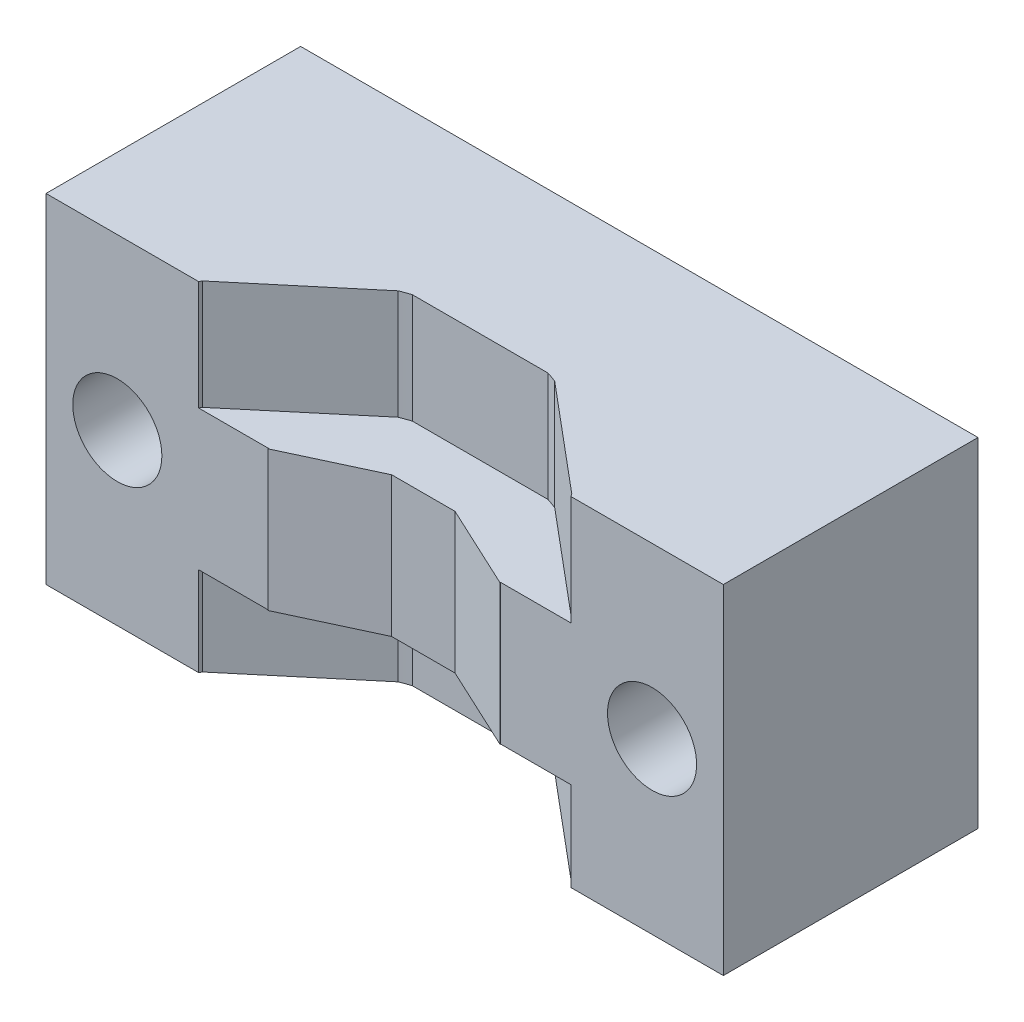
ISO-10303-21;
HEADER;
FILE_DESCRIPTION(('STEP AP214'),'2;1');
FILE_NAME('part.step','',(''),(''),'','','');
FILE_SCHEMA(('AUTOMOTIVE_DESIGN { 1 0 10303 214 1 1 1 1 }'));
ENDSEC;
DATA;
#1=APPLICATION_CONTEXT('core data for automotive mechanical design processes');
#2=APPLICATION_PROTOCOL_DEFINITION('international standard','automotive_design',2000,#1);
#3=PRODUCT_CONTEXT('',#1,'mechanical');
#4=PRODUCT('Part','Part','',(#3));
#5=PRODUCT_RELATED_PRODUCT_CATEGORY('part','',(#4));
#6=PRODUCT_DEFINITION_FORMATION('','',#4);
#7=PRODUCT_DEFINITION_CONTEXT('part definition',#1,'design');
#8=PRODUCT_DEFINITION('design','',#6,#7);
#9=PRODUCT_DEFINITION_SHAPE('','',#8);
#10=(LENGTH_UNIT() NAMED_UNIT(*) SI_UNIT(.MILLI.,.METRE.));
#11=(NAMED_UNIT(*) PLANE_ANGLE_UNIT() SI_UNIT($,.RADIAN.));
#12=(NAMED_UNIT(*) SI_UNIT($,.STERADIAN.) SOLID_ANGLE_UNIT());
#13=UNCERTAINTY_MEASURE_WITH_UNIT(LENGTH_MEASURE(1.E-05),#10,'distance_accuracy_value','');
#14=(GEOMETRIC_REPRESENTATION_CONTEXT(3) GLOBAL_UNCERTAINTY_ASSIGNED_CONTEXT((#13)) GLOBAL_UNIT_ASSIGNED_CONTEXT((#10,
#11,#12)) REPRESENTATION_CONTEXT('',''));
#15=CARTESIAN_POINT('',(0.,0.,0.));
#16=DIRECTION('',(0.,0.,1.));
#17=DIRECTION('',(1.,0.,0.));
#18=AXIS2_PLACEMENT_3D('',#15,#16,#17);
#19=CARTESIAN_POINT('',(0.,2.34999985313752,12.3000057911883));
#20=DIRECTION('',(0.,1.,1.19400339021296E-08));
#21=DIRECTION('',(0.,-1.19400339021296E-08,1.));
#22=AXIS2_PLACEMENT_3D('',#19,#20,#21);
#23=CYLINDRICAL_SURFACE('',#22,8.48);
#24=CARTESIAN_POINT('',(0.,6.64999985313752,12.3000058425304));
#25=DIRECTION('',(0.,1.,1.19400338948147E-08));
#26=DIRECTION('',(0.,-1.19400338948147E-08,1.));
#27=AXIS2_PLACEMENT_3D('',#24,#25,#26);
#28=CIRCLE('',#27,8.48);
#29=CARTESIAN_POINT('',(3.0735688046953,6.64999994750426,4.39661575961008));
#30=VERTEX_POINT('',#29);
#31=CARTESIAN_POINT('',(2.66606451534841,6.64999994925479,4.25000584253044));
#32=VERTEX_POINT('',#31);
#33=EDGE_CURVE('E56',#30,#32,#28,.T.);
#34=ORIENTED_EDGE('',*,*,#33,.T.);
#35=DIRECTION('',(0.,1.,1.19400339021296E-08));
#36=VECTOR('',#35,1.);
#37=CARTESIAN_POINT('',(2.66606451534842,-6.65000017014557,4.25000568372799));
#38=LINE('',#37,#36);
#39=CARTESIAN_POINT('',(2.66606451534842,2.34999994925479,4.2500057911883));
#40=VERTEX_POINT('',#39);
#41=EDGE_CURVE('E264',#40,#32,#38,.T.);
#42=ORIENTED_EDGE('',*,*,#41,.F.);
#43=CARTESIAN_POINT('',(0.,2.34999985313752,12.3000057911883));
#44=DIRECTION('',(0.,1.,1.19400338948147E-08));
#45=DIRECTION('',(0.,-1.19400338948147E-08,1.));
#46=AXIS2_PLACEMENT_3D('',#43,#44,#45);
#47=CIRCLE('',#46,8.48);
#48=CARTESIAN_POINT('',(3.0735688046953,2.34999994750426,4.39661570826794));
#49=VERTEX_POINT('',#48);
#50=EDGE_CURVE('E318',#49,#40,#47,.T.);
#51=ORIENTED_EDGE('',*,*,#50,.F.);
#52=DIRECTION('',(0.,1.,1.19400339021296E-08));
#53=VECTOR('',#52,1.);
#54=CARTESIAN_POINT('',(3.0735688046953,-6.6500001718961,4.39661560080763));
#55=LINE('',#54,#53);
#56=EDGE_CURVE('E273',#49,#30,#55,.T.);
#57=ORIENTED_EDGE('',*,*,#56,.T.);
#58=EDGE_LOOP('',(#34,#42,#51,#57));
#59=FACE_BOUND('',#58,.T.);
#60=ADVANCED_FACE('F33',(#59),#23,.F.);
#61=CARTESIAN_POINT('',(0.,20.8350618709852,12.3000060119006));
#62=DIRECTION('',(0.,-1.,-1.19400339021296E-08));
#63=DIRECTION('',(0.,1.19400339021296E-08,-1.));
#64=AXIS2_PLACEMENT_3D('',#61,#62,#63);
#65=CYLINDRICAL_SURFACE('',#64,8.48);
#66=CARTESIAN_POINT('',(0.,-6.65000014686249,12.300005683728));
#67=DIRECTION('',(0.,-1.,-1.19400339021296E-08));
#68=DIRECTION('',(0.,1.19400339021296E-08,-1.));
#69=AXIS2_PLACEMENT_3D('',#66,#67,#68);
#70=CIRCLE('',#69,8.48);
#71=CARTESIAN_POINT('',(-3.07356880469529,-6.6500001718961,4.39661560080763));
#72=VERTEX_POINT('',#71);
#73=CARTESIAN_POINT('',(-2.66606451534841,-6.65000017014557,4.25000568372799));
#74=VERTEX_POINT('',#73);
#75=EDGE_CURVE('E305',#72,#74,#70,.T.);
#76=ORIENTED_EDGE('',*,*,#75,.T.);
#77=DIRECTION('',(0.,1.,1.19400339021296E-08));
#78=VECTOR('',#77,1.);
#79=CARTESIAN_POINT('',(-2.66606451534841,-6.65000017014557,4.25000568372799));
#80=LINE('',#79,#78);
#81=CARTESIAN_POINT('',(-2.66606451534842,-3.15000005074521,4.25000572551811));
#82=VERTEX_POINT('',#81);
#83=EDGE_CURVE('E265',#74,#82,#80,.T.);
#84=ORIENTED_EDGE('',*,*,#83,.T.);
#85=CARTESIAN_POINT('',(0.,-3.15000014686248,12.3000057255181));
#86=DIRECTION('',(0.,1.,1.19400338948147E-08));
#87=DIRECTION('',(0.,-1.19400338948147E-08,1.));
#88=AXIS2_PLACEMENT_3D('',#85,#86,#87);
#89=CIRCLE('',#88,8.48);
#90=CARTESIAN_POINT('',(-3.0735688046953,-3.15000005249574,4.39661564259776));
#91=VERTEX_POINT('',#90);
#92=EDGE_CURVE('E311',#91,#82,#89,.F.);
#93=ORIENTED_EDGE('',*,*,#92,.F.);
#94=DIRECTION('',(0.,1.,1.19400339021296E-08));
#95=VECTOR('',#94,1.);
#96=CARTESIAN_POINT('',(-3.07356880469529,-6.6500001718961,4.39661560080763));
#97=LINE('',#96,#95);
#98=EDGE_CURVE('E291',#72,#91,#97,.T.);
#99=ORIENTED_EDGE('',*,*,#98,.F.);
#100=EDGE_LOOP('',(#76,#84,#93,#99));
#101=FACE_BOUND('',#100,.T.);
#102=ADVANCED_FACE('F406',(#101),#65,.F.);
#103=CARTESIAN_POINT('',(7.30892620232316,6.64999990447966,8.00000610194976));
#104=VERTEX_POINT('',#103);
#105=CARTESIAN_POINT('',(7.24960020687045,6.64999990566511,7.90072216895995));
#106=VERTEX_POINT('',#105);
#107=EDGE_CURVE('E321',#104,#106,#28,.T.);
#108=ORIENTED_EDGE('',*,*,#107,.T.);
#109=DIRECTION('',(0.,1.,1.19400339021296E-08));
#110=VECTOR('',#109,1.);
#111=CARTESIAN_POINT('',(7.24960020687046,-6.65000021373524,7.9007220101575));
#112=LINE('',#111,#110);
#113=CARTESIAN_POINT('',(7.24960020687046,2.34999992658469,7.90072211761781));
#114=VERTEX_POINT('',#113);
#115=EDGE_CURVE('E279',#114,#106,#112,.T.);
#116=ORIENTED_EDGE('',*,*,#115,.F.);
#117=CARTESIAN_POINT('',(7.30892620232316,2.34999990447966,8.00000605060761));
#118=VERTEX_POINT('',#117);
#119=EDGE_CURVE('E315',#118,#114,#47,.T.);
#120=ORIENTED_EDGE('',*,*,#119,.F.);
#121=DIRECTION('',(0.,1.,1.19400339021296E-08));
#122=VECTOR('',#121,1.);
#123=CARTESIAN_POINT('',(7.30892620232316,2.34999990447966,8.00000605060761));
#124=LINE('',#123,#122);
#125=EDGE_CURVE('E372',#104,#118,#124,.F.);
#126=ORIENTED_EDGE('',*,*,#125,.F.);
#127=EDGE_LOOP('',(#108,#116,#120,#126));
#128=FACE_BOUND('',#127,.T.);
#129=ADVANCED_FACE('F436',(#128),#23,.F.);
#130=CARTESIAN_POINT('',(7.24960020687045,-3.15000009433488,7.90072205194761));
#131=VERTEX_POINT('',#130);
#132=CARTESIAN_POINT('',(7.30892619319099,-3.15000009552034,8.00000596941502));
#133=VERTEX_POINT('',#132);
#134=EDGE_CURVE('E304',#131,#133,#89,.F.);
#135=ORIENTED_EDGE('',*,*,#134,.F.);
#136=CARTESIAN_POINT('',(7.24960020687046,-6.65000021373524,7.9007220101575));
#137=VERTEX_POINT('',#136);
#138=EDGE_CURVE('E276',#137,#131,#112,.T.);
#139=ORIENTED_EDGE('',*,*,#138,.F.);
#140=CARTESIAN_POINT('',(7.30892621145533,-6.65000009552035,8.00000595866971));
#141=VERTEX_POINT('',#140);
#142=EDGE_CURVE('E300',#137,#141,#70,.T.);
#143=ORIENTED_EDGE('',*,*,#142,.T.);
#144=DIRECTION('',(0.,-1.,-1.19400339021296E-08));
#145=VECTOR('',#144,1.);
#146=CARTESIAN_POINT('',(7.30892620232315,20.8350619223274,8.00000627131988));
#147=LINE('',#146,#145);
#148=EDGE_CURVE('E381',#133,#141,#147,.T.);
#149=ORIENTED_EDGE('',*,*,#148,.F.);
#150=EDGE_LOOP('',(#135,#139,#143,#149));
#151=FACE_BOUND('',#150,.T.);
#152=ADVANCED_FACE('F399',(#151),#65,.F.);
#153=CARTESIAN_POINT('',(-2.66606451534842,2.34999994925479,4.2500057911883));
#154=VERTEX_POINT('',#153);
#155=CARTESIAN_POINT('',(-3.0735688046953,2.34999992658469,4.39661570826794));
#156=VERTEX_POINT('',#155);
#157=EDGE_CURVE('E319',#154,#156,#47,.T.);
#158=ORIENTED_EDGE('',*,*,#157,.F.);
#159=CARTESIAN_POINT('',(-2.66606451534842,6.64999994925479,4.25000584253044));
#160=VERTEX_POINT('',#159);
#161=EDGE_CURVE('E48',#154,#160,#80,.T.);
#162=ORIENTED_EDGE('',*,*,#161,.T.);
#163=CARTESIAN_POINT('',(-3.07356880469531,6.64999994750426,4.39661575961008));
#164=VERTEX_POINT('',#163);
#165=EDGE_CURVE('E323',#160,#164,#28,.T.);
#166=ORIENTED_EDGE('',*,*,#165,.T.);
#167=EDGE_CURVE('E294',#156,#164,#97,.T.);
#168=ORIENTED_EDGE('',*,*,#167,.F.);
#169=EDGE_LOOP('',(#158,#162,#166,#168));
#170=FACE_BOUND('',#169,.T.);
#171=ADVANCED_FACE('F489',(#170),#23,.F.);
#172=CARTESIAN_POINT('',(-7.30892590621131,-6.65000009552034,8.00000543983112));
#173=VERTEX_POINT('',#172);
#174=CARTESIAN_POINT('',(-7.24960020687046,-6.65000021373525,7.90072201015751));
#175=VERTEX_POINT('',#174);
#176=EDGE_CURVE('E301',#173,#175,#70,.T.);
#177=ORIENTED_EDGE('',*,*,#176,.T.);
#178=DIRECTION('',(0.,1.,1.19400339021296E-08));
#179=VECTOR('',#178,1.);
#180=CARTESIAN_POINT('',(-7.24960020687046,-6.65000021373525,7.90072201015751));
#181=LINE('',#180,#179);
#182=CARTESIAN_POINT('',(-7.24960020687046,-3.15000007341532,7.90072205194763));
#183=VERTEX_POINT('',#182);
#184=EDGE_CURVE('E295',#175,#183,#181,.T.);
#185=ORIENTED_EDGE('',*,*,#184,.T.);
#186=CARTESIAN_POINT('',(-7.30892588794697,-3.15000009552034,8.00000545057643));
#187=VERTEX_POINT('',#186);
#188=EDGE_CURVE('E307',#187,#183,#89,.F.);
#189=ORIENTED_EDGE('',*,*,#188,.F.);
#190=DIRECTION('',(0.,-1.,-1.19400339021296E-08));
#191=VECTOR('',#190,1.);
#192=CARTESIAN_POINT('',(-7.30892589707915,20.8350619223274,8.00000575248129));
#193=LINE('',#192,#191);
#194=EDGE_CURVE('E378',#173,#187,#193,.F.);
#195=ORIENTED_EDGE('',*,*,#194,.F.);
#196=EDGE_LOOP('',(#177,#185,#189,#195));
#197=FACE_BOUND('',#196,.T.);
#198=ADVANCED_FACE('F500',(#197),#65,.F.);
#199=CARTESIAN_POINT('',(-2.83948126769719E-07,-9.55203400452923E-08,8.00000576312922));
#200=DIRECTION('',(3.54934902773282E-08,1.1940033893981E-08,-0.999999999999999));
#201=DIRECTION('',(-0.999999999999999,0.,-3.54934902773282E-08));
#202=AXIS2_PLACEMENT_3D('',#199,#200,#201);
#203=PLANE('',#202);
#204=CARTESIAN_POINT('',(10.4999997160518,-9.55203588685298E-08,8.00000723874017));
#205=DIRECTION('',(3.54934902681498E-08,1.1940033893981E-08,-0.999999999999999));
#206=DIRECTION('',(-0.999999999999999,0.,-3.54934902681498E-08));
#207=AXIS2_PLACEMENT_3D('',#204,#205,#206);
#208=CIRCLE('',#207,1.75);
#209=CARTESIAN_POINT('',(8.74999971605183,-9.55203588685298E-08,8.00000717662656));
#210=VERTEX_POINT('',#209);
#211=EDGE_CURVE('E325',#210,#210,#208,.T.);
#212=ORIENTED_EDGE('',*,*,#211,.T.);
#213=EDGE_LOOP('',(#212));
#214=FACE_BOUND('',#213,.T.);
#215=DIRECTION('',(0.999999999999999,0.,3.54934902773282E-08));
#216=VECTOR('',#215,1.);
#217=CARTESIAN_POINT('',(-2.83948127797866E-07,2.34999990447966,8.0000057911883));
#218=LINE('',#217,#216);
#219=CARTESIAN_POINT('',(4.54838891657831,2.34999990447966,8.00000605060761));
#220=VERTEX_POINT('',#219);
#221=EDGE_CURVE('E365',#220,#118,#218,.T.);
#222=ORIENTED_EDGE('',*,*,#221,.F.);
#223=DIRECTION('',(0.,-1.,-1.19400338939809E-08));
#224=VECTOR('',#223,1.);
#225=CARTESIAN_POINT('',(4.54838886991722,-9.55203399491841E-08,8.00000592456743));
#226=LINE('',#225,#224);
#227=CARTESIAN_POINT('',(4.54838890918615,-3.15000009552034,8.00000596941502));
#228=VERTEX_POINT('',#227);
#229=EDGE_CURVE('E251',#220,#228,#226,.T.);
#230=ORIENTED_EDGE('',*,*,#229,.T.);
#231=DIRECTION('',(0.999999999999999,0.,3.54934902773282E-08));
#232=VECTOR('',#231,1.);
#233=CARTESIAN_POINT('',(-2.83948125391564E-07,-3.15000009552034,8.00000572551812));
#234=LINE('',#233,#232);
#235=EDGE_CURVE('E310',#228,#133,#234,.T.);
#236=ORIENTED_EDGE('',*,*,#235,.T.);
#237=ORIENTED_EDGE('',*,*,#148,.T.);
#238=DIRECTION('',(-0.999999999999999,0.,-3.54934902773282E-08));
#239=VECTOR('',#238,1.);
#240=CARTESIAN_POINT('',(-13.3000002839481,-6.65000009552034,8.00000521166458));
#241=LINE('',#240,#239);
#242=CARTESIAN_POINT('',(13.2999997160519,-6.65000009552034,8.00000615579142));
#243=VERTEX_POINT('',#242);
#244=EDGE_CURVE('E342',#243,#141,#241,.T.);
#245=ORIENTED_EDGE('',*,*,#244,.F.);
#246=DIRECTION('',(0.,-1.,-1.19400338939809E-08));
#247=VECTOR('',#246,1.);
#248=CARTESIAN_POINT('',(13.2999997160519,-6.65000009552034,8.00000615579142));
#249=LINE('',#248,#247);
#250=CARTESIAN_POINT('',(13.2999997160519,6.64999990447966,8.00000631459387));
#251=VERTEX_POINT('',#250);
#252=EDGE_CURVE('E337',#251,#243,#249,.T.);
#253=ORIENTED_EDGE('',*,*,#252,.F.);
#254=DIRECTION('',(0.999999999999999,0.,3.54934902773282E-08));
#255=VECTOR('',#254,1.);
#256=CARTESIAN_POINT('',(-13.3000002839481,6.64999990447966,8.00000537046703));
#257=LINE('',#256,#255);
#258=EDGE_CURVE('E348',#104,#251,#257,.T.);
#259=ORIENTED_EDGE('',*,*,#258,.F.);
#260=ORIENTED_EDGE('',*,*,#125,.T.);
#261=EDGE_LOOP('',(#222,#230,#236,#237,#245,#253,#259,#260));
#262=FACE_BOUND('',#261,.T.);
#263=ADVANCED_FACE('F421',(#214,#262),#203,.F.);
#264=CARTESIAN_POINT('',(13.2999997160519,-6.65000009552034,8.00000615579142));
#265=DIRECTION('',(0.999999999999999,0.,3.54934902770804E-08));
#266=DIRECTION('',(3.54934902770804E-08,0.,-0.999999999999999));
#267=AXIS2_PLACEMENT_3D('',#264,#265,#266);
#268=PLANE('',#267);
#269=DIRECTION('',(0.,-1.,-1.19400338939809E-08));
#270=VECTOR('',#269,1.);
#271=CARTESIAN_POINT('',(13.3000000709868,-6.64999997612,-1.99999384420858));
#272=LINE('',#271,#270);
#273=CARTESIAN_POINT('',(13.3000000709868,6.65000002388,-1.99999368540612));
#274=VERTEX_POINT('',#273);
#275=CARTESIAN_POINT('',(13.3000000709868,-6.64999997612,-1.99999384420858));
#276=VERTEX_POINT('',#275);
#277=EDGE_CURVE('E328',#274,#276,#272,.T.);
#278=ORIENTED_EDGE('',*,*,#277,.F.);
#279=DIRECTION('',(3.54934902770804E-08,1.19400339021296E-08,-0.999999999999999));
#280=VECTOR('',#279,1.);
#281=CARTESIAN_POINT('',(13.2999997160519,6.64999990447966,8.00000631459387));
#282=LINE('',#281,#280);
#283=EDGE_CURVE('E363',#251,#274,#282,.T.);
#284=ORIENTED_EDGE('',*,*,#283,.F.);
#285=ORIENTED_EDGE('',*,*,#252,.T.);
#286=DIRECTION('',(3.54934902770804E-08,1.19400339021296E-08,-0.999999999999999));
#287=VECTOR('',#286,1.);
#288=CARTESIAN_POINT('',(13.2999997160519,-6.65000009552034,8.00000615579142));
#289=LINE('',#288,#287);
#290=EDGE_CURVE('E352',#243,#276,#289,.T.);
#291=ORIENTED_EDGE('',*,*,#290,.T.);
#292=EDGE_LOOP('',(#278,#284,#285,#291));
#293=FACE_BOUND('',#292,.T.);
#294=ADVANCED_FACE('F35',(#293),#268,.T.);
#295=CARTESIAN_POINT('',(-13.3000002839481,6.64999990447966,8.00000537046703));
#296=DIRECTION('',(0.,1.,1.19400339021296E-08));
#297=DIRECTION('',(0.,-1.19400339021296E-08,1.));
#298=AXIS2_PLACEMENT_3D('',#295,#296,#297);
#299=PLANE('',#298);
#300=ORIENTED_EDGE('',*,*,#165,.F.);
#301=DIRECTION('',(1.,0.,0.));
#302=VECTOR('',#301,1.);
#303=CARTESIAN_POINT('',(-2.66606451534842,6.64999994925479,4.25000584253044));
#304=LINE('',#303,#302);
#305=EDGE_CURVE('E256',#160,#32,#304,.T.);
#306=ORIENTED_EDGE('',*,*,#305,.T.);
#307=ORIENTED_EDGE('',*,*,#33,.F.);
#308=DIRECTION('',(0.766044443118982,-7.67490553483057E-09,0.642787609686535));
#309=VECTOR('',#308,1.);
#310=CARTESIAN_POINT('',(7.24960020687046,6.64999990566511,7.90072216895996));
#311=LINE('',#310,#309);
#312=EDGE_CURVE('E270',#30,#106,#311,.T.);
#313=ORIENTED_EDGE('',*,*,#312,.T.);
#314=ORIENTED_EDGE('',*,*,#107,.F.);
#315=ORIENTED_EDGE('',*,*,#258,.T.);
#316=ORIENTED_EDGE('',*,*,#283,.T.);
#317=DIRECTION('',(0.999999999999999,0.,3.54934902773282E-08));
#318=VECTOR('',#317,1.);
#319=CARTESIAN_POINT('',(-13.2999999290132,6.65000002388,-1.99999462953297));
#320=LINE('',#319,#318);
#321=CARTESIAN_POINT('',(-13.2999999290132,6.65000002388,-1.99999462953297));
#322=VERTEX_POINT('',#321);
#323=EDGE_CURVE('E341',#322,#274,#320,.T.);
#324=ORIENTED_EDGE('',*,*,#323,.F.);
#325=DIRECTION('',(3.54934902770804E-08,1.19400339021296E-08,-0.999999999999999));
#326=VECTOR('',#325,1.);
#327=CARTESIAN_POINT('',(-13.3000002839481,6.64999990447966,8.00000537046703));
#328=LINE('',#327,#326);
#329=CARTESIAN_POINT('',(-13.3000002839481,6.64999990447966,8.00000537046703));
#330=VERTEX_POINT('',#329);
#331=EDGE_CURVE('E366',#330,#322,#328,.T.);
#332=ORIENTED_EDGE('',*,*,#331,.F.);
#333=CARTESIAN_POINT('',(-7.30892589707915,6.64999990447966,8.00000558311117));
#334=VERTEX_POINT('',#333);
#335=EDGE_CURVE('E349',#330,#334,#257,.T.);
#336=ORIENTED_EDGE('',*,*,#335,.T.);
#337=CARTESIAN_POINT('',(-7.24960020687047,6.64999990566511,7.90072216895997));
#338=VERTEX_POINT('',#337);
#339=EDGE_CURVE('E324',#338,#334,#28,.T.);
#340=ORIENTED_EDGE('',*,*,#339,.F.);
#341=DIRECTION('',(0.766044443118981,7.6749061712603E-09,-0.642787609686535));
#342=VECTOR('',#341,1.);
#343=CARTESIAN_POINT('',(-7.24960020687046,6.64999990566511,7.90072216895996));
#344=LINE('',#343,#342);
#345=EDGE_CURVE('E285',#338,#164,#344,.T.);
#346=ORIENTED_EDGE('',*,*,#345,.T.);
#347=EDGE_LOOP('',(#300,#306,#307,#313,#314,#315,#316,#324,#332,#336,#340,#346));
#348=FACE_BOUND('',#347,.T.);
#349=ADVANCED_FACE('F430',(#348),#299,.T.);
#350=CARTESIAN_POINT('',(-13.3000002839481,-6.65000009552034,8.00000521166458));
#351=DIRECTION('',(-0.999999999999999,0.,-3.54934902770804E-08));
#352=DIRECTION('',(-3.54934902770804E-08,0.,0.999999999999999));
#353=AXIS2_PLACEMENT_3D('',#350,#351,#352);
#354=PLANE('',#353);
#355=DIRECTION('',(0.,1.,1.19400338939809E-08));
#356=VECTOR('',#355,1.);
#357=CARTESIAN_POINT('',(-13.2999999290132,-6.64999997612,-1.99999478833542));
#358=LINE('',#357,#356);
#359=CARTESIAN_POINT('',(-13.2999999290132,-6.64999997612,-1.99999478833542));
#360=VERTEX_POINT('',#359);
#361=EDGE_CURVE('E358',#360,#322,#358,.T.);
#362=ORIENTED_EDGE('',*,*,#361,.F.);
#363=DIRECTION('',(3.54934902770804E-08,1.19400339021296E-08,-0.999999999999999));
#364=VECTOR('',#363,1.);
#365=CARTESIAN_POINT('',(-13.3000002839481,-6.65000009552034,8.00000521166458));
#366=LINE('',#365,#364);
#367=CARTESIAN_POINT('',(-13.3000002839481,-6.65000009552034,8.00000521166458));
#368=VERTEX_POINT('',#367);
#369=EDGE_CURVE('E368',#368,#360,#366,.T.);
#370=ORIENTED_EDGE('',*,*,#369,.F.);
#371=DIRECTION('',(0.,1.,1.19400338939809E-08));
#372=VECTOR('',#371,1.);
#373=CARTESIAN_POINT('',(-13.3000002839481,-6.65000009552034,8.00000521166458));
#374=LINE('',#373,#372);
#375=EDGE_CURVE('E345',#368,#330,#374,.T.);
#376=ORIENTED_EDGE('',*,*,#375,.T.);
#377=ORIENTED_EDGE('',*,*,#331,.T.);
#378=EDGE_LOOP('',(#362,#370,#376,#377));
#379=FACE_BOUND('',#378,.T.);
#380=ADVANCED_FACE('F518',(#379),#354,.T.);
#381=CARTESIAN_POINT('',(-13.3000002839481,-6.65000009552034,8.00000521166458));
#382=DIRECTION('',(0.,-1.,-1.19400339021296E-08));
#383=DIRECTION('',(0.,1.19400339021296E-08,-1.));
#384=AXIS2_PLACEMENT_3D('',#381,#382,#383);
#385=PLANE('',#384);
#386=DIRECTION('',(1.,0.,0.));
#387=VECTOR('',#386,1.);
#388=CARTESIAN_POINT('',(-2.66606451534841,-6.65000017014557,4.25000568372799));
#389=LINE('',#388,#387);
#390=CARTESIAN_POINT('',(2.66606451534842,-6.65000017014557,4.25000568372799));
#391=VERTEX_POINT('',#390);
#392=EDGE_CURVE('E257',#74,#391,#389,.T.);
#393=ORIENTED_EDGE('',*,*,#392,.F.);
#394=ORIENTED_EDGE('',*,*,#75,.F.);
#395=DIRECTION('',(0.766044443118981,7.6749061712603E-09,-0.642787609686535));
#396=VECTOR('',#395,1.);
#397=CARTESIAN_POINT('',(-7.24960020687046,-6.65000021373525,7.90072201015751));
#398=LINE('',#397,#396);
#399=EDGE_CURVE('E286',#175,#72,#398,.T.);
#400=ORIENTED_EDGE('',*,*,#399,.F.);
#401=ORIENTED_EDGE('',*,*,#176,.F.);
#402=EDGE_CURVE('E340',#173,#368,#241,.T.);
#403=ORIENTED_EDGE('',*,*,#402,.T.);
#404=ORIENTED_EDGE('',*,*,#369,.T.);
#405=DIRECTION('',(-0.999999999999999,0.,-3.54934902773282E-08));
#406=VECTOR('',#405,1.);
#407=CARTESIAN_POINT('',(-13.2999999290132,-6.64999997612,-1.99999478833542));
#408=LINE('',#407,#406);
#409=EDGE_CURVE('E355',#276,#360,#408,.T.);
#410=ORIENTED_EDGE('',*,*,#409,.F.);
#411=ORIENTED_EDGE('',*,*,#290,.F.);
#412=ORIENTED_EDGE('',*,*,#244,.T.);
#413=ORIENTED_EDGE('',*,*,#142,.F.);
#414=DIRECTION('',(0.766044443118982,-7.67490553483057E-09,0.642787609686535));
#415=VECTOR('',#414,1.);
#416=CARTESIAN_POINT('',(7.24960020687046,-6.65000021373524,7.9007220101575));
#417=LINE('',#416,#415);
#418=CARTESIAN_POINT('',(3.0735688046953,-6.6500001718961,4.39661560080763));
#419=VERTEX_POINT('',#418);
#420=EDGE_CURVE('E271',#419,#137,#417,.T.);
#421=ORIENTED_EDGE('',*,*,#420,.F.);
#422=EDGE_CURVE('E306',#391,#419,#70,.T.);
#423=ORIENTED_EDGE('',*,*,#422,.F.);
#424=EDGE_LOOP('',(#393,#394,#400,#401,#403,#404,#410,#411,#412,#413,#421,#423));
#425=FACE_BOUND('',#424,.T.);
#426=ADVANCED_FACE('F414',(#425),#385,.T.);
#427=CARTESIAN_POINT('',(-10.5000002839482,-9.55203171004221E-08,8.00000649337687));
#428=DIRECTION('',(3.54934902681498E-08,1.1940033893981E-08,-0.999999999999999));
#429=DIRECTION('',(0.999999999999999,0.,3.54934902681498E-08));
#430=AXIS2_PLACEMENT_3D('',#427,#428,#429);
#431=CIRCLE('',#430,1.75);
#432=CARTESIAN_POINT('',(-8.75000028394816,-9.55203171004221E-08,8.00000655549048));
#433=VERTEX_POINT('',#432);
#434=EDGE_CURVE('E332',#433,#433,#431,.T.);
#435=ORIENTED_EDGE('',*,*,#434,.T.);
#436=EDGE_LOOP('',(#435));
#437=FACE_BOUND('',#436,.T.);
#438=CARTESIAN_POINT('',(-4.54838890918615,-3.15000009552035,8.00000596941502));
#439=VERTEX_POINT('',#438);
#440=EDGE_CURVE('E314',#187,#439,#234,.T.);
#441=ORIENTED_EDGE('',*,*,#440,.T.);
#442=DIRECTION('',(0.,1.,1.19400338939809E-08));
#443=VECTOR('',#442,1.);
#444=CARTESIAN_POINT('',(-4.54838871615525,-9.55203400531649E-08,8.00000560169104));
#445=LINE('',#444,#443);
#446=CARTESIAN_POINT('',(-4.54838891657832,2.34999990447966,8.00000605060761));
#447=VERTEX_POINT('',#446);
#448=EDGE_CURVE('E254',#439,#447,#445,.T.);
#449=ORIENTED_EDGE('',*,*,#448,.T.);
#450=CARTESIAN_POINT('',(-7.30892589707914,2.34999990447966,8.00000553176902));
#451=VERTEX_POINT('',#450);
#452=EDGE_CURVE('E216',#451,#447,#218,.T.);
#453=ORIENTED_EDGE('',*,*,#452,.F.);
#454=DIRECTION('',(0.,1.,1.19400339021296E-08));
#455=VECTOR('',#454,1.);
#456=CARTESIAN_POINT('',(-7.30892589707914,2.34999990447966,8.00000553176902));
#457=LINE('',#456,#455);
#458=EDGE_CURVE('E375',#451,#334,#457,.T.);
#459=ORIENTED_EDGE('',*,*,#458,.T.);
#460=ORIENTED_EDGE('',*,*,#335,.F.);
#461=ORIENTED_EDGE('',*,*,#375,.F.);
#462=ORIENTED_EDGE('',*,*,#402,.F.);
#463=ORIENTED_EDGE('',*,*,#194,.T.);
#464=EDGE_LOOP('',(#441,#449,#453,#459,#460,#461,#462,#463));
#465=FACE_BOUND('',#464,.T.);
#466=ADVANCED_FACE('F451',(#437,#465),#203,.F.);
#467=CARTESIAN_POINT('',(7.09867760010852E-08,2.38799989760036E-08,-1.99999423687077));
#468=DIRECTION('',(3.54934902773282E-08,1.1940033893981E-08,-0.999999999999999));
#469=DIRECTION('',(-0.999999999999999,0.,-3.54934902773282E-08));
#470=AXIS2_PLACEMENT_3D('',#467,#468,#469);
#471=PLANE('',#470);
#472=CARTESIAN_POINT('',(10.5000000709868,2.3879993240293E-08,-1.99999386418912));
#473=DIRECTION('',(3.54934902681498E-08,1.1940033893981E-08,-0.999999999999999));
#474=DIRECTION('',(-0.999999999999999,0.,-3.54934902681498E-08));
#475=AXIS2_PLACEMENT_3D('',#472,#473,#474);
#476=CIRCLE('',#475,1.75);
#477=CARTESIAN_POINT('',(8.75000007098677,2.3879993240293E-08,-1.99999392630273));
#478=VERTEX_POINT('',#477);
#479=EDGE_CURVE('E329',#478,#478,#476,.T.);
#480=ORIENTED_EDGE('',*,*,#479,.F.);
#481=EDGE_LOOP('',(#480));
#482=FACE_BOUND('',#481,.T.);
#483=CARTESIAN_POINT('',(-10.4999999290132,2.38800350084007E-08,-1.99999460955242));
#484=DIRECTION('',(3.54934902681498E-08,1.1940033893981E-08,-0.999999999999999));
#485=DIRECTION('',(0.999999999999999,0.,3.54934902681498E-08));
#486=AXIS2_PLACEMENT_3D('',#483,#484,#485);
#487=CIRCLE('',#486,1.75);
#488=CARTESIAN_POINT('',(-8.74999992901322,2.38800350084007E-08,-1.99999454743881));
#489=VERTEX_POINT('',#488);
#490=EDGE_CURVE('E317',#489,#489,#487,.T.);
#491=ORIENTED_EDGE('',*,*,#490,.F.);
#492=EDGE_LOOP('',(#491));
#493=FACE_BOUND('',#492,.T.);
#494=ORIENTED_EDGE('',*,*,#277,.T.);
#495=ORIENTED_EDGE('',*,*,#409,.T.);
#496=ORIENTED_EDGE('',*,*,#361,.T.);
#497=ORIENTED_EDGE('',*,*,#323,.T.);
#498=EDGE_LOOP('',(#494,#495,#496,#497));
#499=FACE_BOUND('',#498,.T.);
#500=ADVANCED_FACE('F602',(#482,#493,#499),#471,.T.);
#501=CARTESIAN_POINT('',(-10.5000002839482,-9.55203171004221E-08,8.00000649337687));
#502=DIRECTION('',(3.54934902681498E-08,1.1940033893981E-08,-0.999999999999999));
#503=DIRECTION('',(-1.,0.,-3.54934902681498E-08));
#504=AXIS2_PLACEMENT_3D('',#501,#502,#503);
#505=CYLINDRICAL_SURFACE('',#504,1.75);
#506=ORIENTED_EDGE('',*,*,#434,.F.);
#507=EDGE_LOOP('',(#506));
#508=FACE_BOUND('',#507,.T.);
#509=ORIENTED_EDGE('',*,*,#490,.T.);
#510=EDGE_LOOP('',(#509));
#511=FACE_BOUND('',#510,.T.);
#512=ADVANCED_FACE('F497',(#508,#511),#505,.F.);
#513=CARTESIAN_POINT('',(10.4999997160518,-9.55203588685298E-08,8.00000723874017));
#514=DIRECTION('',(3.54934902681498E-08,1.1940033893981E-08,-0.999999999999999));
#515=DIRECTION('',(-1.,0.,-3.54934902681498E-08));
#516=AXIS2_PLACEMENT_3D('',#513,#514,#515);
#517=CYLINDRICAL_SURFACE('',#516,1.75);
#518=ORIENTED_EDGE('',*,*,#211,.F.);
#519=EDGE_LOOP('',(#518));
#520=FACE_BOUND('',#519,.T.);
#521=ORIENTED_EDGE('',*,*,#479,.T.);
#522=EDGE_LOOP('',(#521));
#523=FACE_BOUND('',#522,.T.);
#524=ADVANCED_FACE('F491',(#520,#523),#517,.F.);
#525=CARTESIAN_POINT('',(-7.24960020687046,2.34999990566511,7.90072211761781));
#526=VERTEX_POINT('',#525);
#527=EDGE_CURVE('E320',#526,#451,#47,.T.);
#528=ORIENTED_EDGE('',*,*,#527,.F.);
#529=EDGE_CURVE('E288',#526,#338,#181,.T.);
#530=ORIENTED_EDGE('',*,*,#529,.T.);
#531=ORIENTED_EDGE('',*,*,#339,.T.);
#532=ORIENTED_EDGE('',*,*,#458,.F.);
#533=EDGE_LOOP('',(#528,#530,#531,#532));
#534=FACE_BOUND('',#533,.T.);
#535=ADVANCED_FACE('F446',(#534),#23,.F.);
#536=CARTESIAN_POINT('',(0.,2.35,2.80590796213606E-08));
#537=DIRECTION('',(0.,1.,1.19400338948147E-08));
#538=DIRECTION('',(0.,-1.19400338948147E-08,1.));
#539=AXIS2_PLACEMENT_3D('',#536,#537,#538);
#540=PLANE('',#539);
#541=DIRECTION('',(-0.429959349909141,1.07800386165644E-08,-0.902848247174302));
#542=VECTOR('',#541,1.);
#543=CARTESIAN_POINT('',(4.56136047147631,2.34999990415444,8.02724431302767));
#544=LINE('',#543,#542);
#545=CARTESIAN_POINT('',(4.56136047147631,2.34999990415444,8.02724431302767));
#546=VERTEX_POINT('',#545);
#547=EDGE_CURVE('E229',#546,#220,#544,.T.);
#548=ORIENTED_EDGE('',*,*,#547,.T.);
#549=ORIENTED_EDGE('',*,*,#221,.T.);
#550=ORIENTED_EDGE('',*,*,#119,.T.);
#551=DIRECTION('',(0.766044443118982,-7.67490551167247E-09,0.642787609686535));
#552=VECTOR('',#551,1.);
#553=CARTESIAN_POINT('',(-0.89498601302936,2.34999998726473,1.0666028244084));
#554=LINE('',#553,#552);
#555=EDGE_CURVE('E278',#49,#114,#554,.T.);
#556=ORIENTED_EDGE('',*,*,#555,.F.);
#557=ORIENTED_EDGE('',*,*,#50,.T.);
#558=DIRECTION('',(1.,0.,0.));
#559=VECTOR('',#558,1.);
#560=CARTESIAN_POINT('',(0.,2.34999994925479,4.2500057911883));
#561=LINE('',#560,#559);
#562=EDGE_CURVE('E263',#154,#40,#561,.T.);
#563=ORIENTED_EDGE('',*,*,#562,.F.);
#564=ORIENTED_EDGE('',*,*,#157,.T.);
#565=DIRECTION('',(0.766044443118982,7.67490618197583E-09,-0.642787609686535));
#566=VECTOR('',#565,1.);
#567=CARTESIAN_POINT('',(0.894986013029357,2.34999998726473,1.0666028244084));
#568=LINE('',#567,#566);
#569=EDGE_CURVE('E293',#526,#156,#568,.T.);
#570=ORIENTED_EDGE('',*,*,#569,.F.);
#571=ORIENTED_EDGE('',*,*,#527,.T.);
#572=ORIENTED_EDGE('',*,*,#452,.T.);
#573=DIRECTION('',(-0.429959349909141,-1.07800389975186E-08,0.902848247174302));
#574=VECTOR('',#573,1.);
#575=CARTESIAN_POINT('',(-4.56136047147631,2.34999990415443,8.02724431302767));
#576=LINE('',#575,#574);
#577=CARTESIAN_POINT('',(-4.56136047147631,2.34999990415443,8.02724431302767));
#578=VERTEX_POINT('',#577);
#579=EDGE_CURVE('E208',#447,#578,#576,.T.);
#580=ORIENTED_EDGE('',*,*,#579,.T.);
#581=DIRECTION('',(0.906307787036653,5.0460768283649E-09,-0.422618261740694));
#582=VECTOR('',#581,1.);
#583=CARTESIAN_POINT('',(-4.56136047147631,2.34999990415443,8.02724431302767));
#584=LINE('',#583,#582);
#585=CARTESIAN_POINT('',(-1.24329675371275,2.34999992262851,6.4800057911883));
#586=VERTEX_POINT('',#585);
#587=EDGE_CURVE('E214',#578,#586,#584,.T.);
#588=ORIENTED_EDGE('',*,*,#587,.T.);
#589=DIRECTION('',(1.,0.,0.));
#590=VECTOR('',#589,1.);
#591=CARTESIAN_POINT('',(-1.24329675371275,2.34999992262851,6.4800057911883));
#592=LINE('',#591,#590);
#593=CARTESIAN_POINT('',(1.24329675371275,2.34999992262851,6.4800057911883));
#594=VERTEX_POINT('',#593);
#595=EDGE_CURVE('E234',#586,#594,#592,.T.);
#596=ORIENTED_EDGE('',*,*,#595,.T.);
#597=DIRECTION('',(0.906307787036652,-5.0460759991649E-09,0.422618261740694));
#598=VECTOR('',#597,1.);
#599=CARTESIAN_POINT('',(4.56136047147631,2.34999990415444,8.02724431302767));
#600=LINE('',#599,#598);
#601=EDGE_CURVE('E236',#594,#546,#600,.T.);
#602=ORIENTED_EDGE('',*,*,#601,.T.);
#603=EDGE_LOOP('',(#548,#549,#550,#556,#557,#563,#564,#570,#571,#572,#580,#588,#596,#602));
#604=FACE_BOUND('',#603,.T.);
#605=ADVANCED_FACE('F211',(#604),#540,.T.);
#606=CARTESIAN_POINT('',(2.6660645153484,-3.15000005074521,4.25000572551811));
#607=VERTEX_POINT('',#606);
#608=CARTESIAN_POINT('',(3.0735688046953,-3.15000005249574,4.39661564259775));
#609=VERTEX_POINT('',#608);
#610=EDGE_CURVE('E312',#607,#609,#89,.F.);
#611=ORIENTED_EDGE('',*,*,#610,.F.);
#612=EDGE_CURVE('E261',#391,#607,#38,.T.);
#613=ORIENTED_EDGE('',*,*,#612,.F.);
#614=ORIENTED_EDGE('',*,*,#422,.T.);
#615=EDGE_CURVE('E280',#419,#609,#55,.T.);
#616=ORIENTED_EDGE('',*,*,#615,.T.);
#617=EDGE_LOOP('',(#611,#613,#614,#616));
#618=FACE_BOUND('',#617,.T.);
#619=ADVANCED_FACE('F485',(#618),#65,.F.);
#620=CARTESIAN_POINT('',(0.,-3.15,-3.76111068403522E-08));
#621=DIRECTION('',(0.,1.,1.19400338948147E-08));
#622=DIRECTION('',(0.,-1.19400338948147E-08,1.));
#623=AXIS2_PLACEMENT_3D('',#620,#621,#622);
#624=PLANE('',#623);
#625=ORIENTED_EDGE('',*,*,#235,.F.);
#626=DIRECTION('',(0.42995934990914,-1.07800384850239E-08,0.902848247174302));
#627=VECTOR('',#626,1.);
#628=CARTESIAN_POINT('',(4.56136047147631,-3.15000009584557,8.02724424735748));
#629=LINE('',#628,#627);
#630=CARTESIAN_POINT('',(4.56136047147632,-3.15000009584557,8.02724424735748));
#631=VERTEX_POINT('',#630);
#632=EDGE_CURVE('E453',#228,#631,#629,.T.);
#633=ORIENTED_EDGE('',*,*,#632,.T.);
#634=DIRECTION('',(-0.906307787036653,5.04607597323334E-09,-0.422618261740694));
#635=VECTOR('',#634,1.);
#636=CARTESIAN_POINT('',(4.56136047147631,-3.15000009584557,8.02724424735748));
#637=LINE('',#636,#635);
#638=CARTESIAN_POINT('',(1.24329675371276,-3.15000007737149,6.48000572551811));
#639=VERTEX_POINT('',#638);
#640=EDGE_CURVE('E454',#631,#639,#637,.T.);
#641=ORIENTED_EDGE('',*,*,#640,.T.);
#642=DIRECTION('',(-1.,0.,0.));
#643=VECTOR('',#642,1.);
#644=CARTESIAN_POINT('',(-1.24329675371275,-3.15000007737149,6.48000572551811));
#645=LINE('',#644,#643);
#646=CARTESIAN_POINT('',(-1.24329675371275,-3.15000008660853,6.48000572551811));
#647=VERTEX_POINT('',#646);
#648=EDGE_CURVE('E245',#639,#647,#645,.T.);
#649=ORIENTED_EDGE('',*,*,#648,.T.);
#650=DIRECTION('',(-0.906307787036652,-5.04607676626977E-09,0.422618261740694));
#651=VECTOR('',#650,1.);
#652=CARTESIAN_POINT('',(-4.56136047147631,-3.15000009584557,8.02724424735748));
#653=LINE('',#652,#651);
#654=CARTESIAN_POINT('',(-4.56136047147631,-3.15000009584557,8.02724424735748));
#655=VERTEX_POINT('',#654);
#656=EDGE_CURVE('E249',#647,#655,#653,.T.);
#657=ORIENTED_EDGE('',*,*,#656,.T.);
#658=DIRECTION('',(0.42995934990914,1.07800388612465E-08,-0.902848247174302));
#659=VECTOR('',#658,1.);
#660=CARTESIAN_POINT('',(-4.56136047147631,-3.15000009584557,8.02724424735748));
#661=LINE('',#660,#659);
#662=EDGE_CURVE('E225',#655,#439,#661,.T.);
#663=ORIENTED_EDGE('',*,*,#662,.T.);
#664=ORIENTED_EDGE('',*,*,#440,.F.);
#665=ORIENTED_EDGE('',*,*,#188,.T.);
#666=DIRECTION('',(0.766044443118982,7.67490618197583E-09,-0.642787609686535));
#667=VECTOR('',#666,1.);
#668=CARTESIAN_POINT('',(0.89498601302936,-3.15000001273527,1.06660275873821));
#669=LINE('',#668,#667);
#670=EDGE_CURVE('E384',#183,#91,#669,.T.);
#671=ORIENTED_EDGE('',*,*,#670,.T.);
#672=ORIENTED_EDGE('',*,*,#92,.T.);
#673=DIRECTION('',(1.,0.,0.));
#674=VECTOR('',#673,1.);
#675=CARTESIAN_POINT('',(0.,-3.15000005074521,4.25000572551811));
#676=LINE('',#675,#674);
#677=EDGE_CURVE('E11',#82,#607,#676,.T.);
#678=ORIENTED_EDGE('',*,*,#677,.T.);
#679=ORIENTED_EDGE('',*,*,#610,.T.);
#680=DIRECTION('',(0.766044443118982,-7.67490551167247E-09,0.642787609686535));
#681=VECTOR('',#680,1.);
#682=CARTESIAN_POINT('',(-0.894986013029357,-3.15000001273527,1.06660275873821));
#683=LINE('',#682,#681);
#684=EDGE_CURVE('E41',#609,#131,#683,.T.);
#685=ORIENTED_EDGE('',*,*,#684,.T.);
#686=ORIENTED_EDGE('',*,*,#134,.T.);
#687=EDGE_LOOP('',(#625,#633,#641,#649,#657,#663,#664,#665,#671,#672,#678,#679,#685,#686));
#688=FACE_BOUND('',#687,.T.);
#689=ADVANCED_FACE('F392',(#688),#624,.F.);
#690=CARTESIAN_POINT('',(-7.24960020687046,-6.65000021373525,7.90072201015751));
#691=DIRECTION('',(0.642787609686535,-9.14659634896942E-09,0.766044443118981));
#692=DIRECTION('',(0.766044443118982,0.,-0.642787609686535));
#693=AXIS2_PLACEMENT_3D('',#690,#691,#692);
#694=PLANE('',#693);
#695=ORIENTED_EDGE('',*,*,#670,.F.);
#696=ORIENTED_EDGE('',*,*,#184,.F.);
#697=ORIENTED_EDGE('',*,*,#399,.T.);
#698=ORIENTED_EDGE('',*,*,#98,.T.);
#699=EDGE_LOOP('',(#695,#696,#697,#698));
#700=FACE_BOUND('',#699,.T.);
#701=ADVANCED_FACE('F521',(#700),#694,.T.);
#702=ORIENTED_EDGE('',*,*,#529,.F.);
#703=ORIENTED_EDGE('',*,*,#569,.T.);
#704=ORIENTED_EDGE('',*,*,#167,.T.);
#705=ORIENTED_EDGE('',*,*,#345,.F.);
#706=EDGE_LOOP('',(#702,#703,#704,#705));
#707=FACE_BOUND('',#706,.T.);
#708=ADVANCED_FACE('F512',(#707),#694,.T.);
#709=CARTESIAN_POINT('',(7.24960020687046,-6.65000021373524,7.9007220101575));
#710=DIRECTION('',(-0.642787609686535,-9.14659689378782E-09,0.766044443118982));
#711=DIRECTION('',(0.766044443118982,0.,0.642787609686535));
#712=AXIS2_PLACEMENT_3D('',#709,#710,#711);
#713=PLANE('',#712);
#714=ORIENTED_EDGE('',*,*,#684,.F.);
#715=ORIENTED_EDGE('',*,*,#615,.F.);
#716=ORIENTED_EDGE('',*,*,#420,.T.);
#717=ORIENTED_EDGE('',*,*,#138,.T.);
#718=EDGE_LOOP('',(#714,#715,#716,#717));
#719=FACE_BOUND('',#718,.T.);
#720=ADVANCED_FACE('F527',(#719),#713,.T.);
#721=ORIENTED_EDGE('',*,*,#56,.F.);
#722=ORIENTED_EDGE('',*,*,#555,.T.);
#723=ORIENTED_EDGE('',*,*,#115,.T.);
#724=ORIENTED_EDGE('',*,*,#312,.F.);
#725=EDGE_LOOP('',(#721,#722,#723,#724));
#726=FACE_BOUND('',#725,.T.);
#727=ADVANCED_FACE('F440',(#726),#713,.T.);
#728=CARTESIAN_POINT('',(-2.66606451534841,-6.65000017014557,4.25000568372799));
#729=DIRECTION('',(0.,-1.19400339021296E-08,1.));
#730=DIRECTION('',(0.,-1.,-1.19400339021296E-08));
#731=AXIS2_PLACEMENT_3D('',#728,#729,#730);
#732=PLANE('',#731);
#733=ORIENTED_EDGE('',*,*,#677,.F.);
#734=ORIENTED_EDGE('',*,*,#83,.F.);
#735=ORIENTED_EDGE('',*,*,#392,.T.);
#736=ORIENTED_EDGE('',*,*,#612,.T.);
#737=EDGE_LOOP('',(#733,#734,#735,#736));
#738=FACE_BOUND('',#737,.T.);
#739=ADVANCED_FACE('F410',(#738),#732,.T.);
#740=ORIENTED_EDGE('',*,*,#161,.F.);
#741=ORIENTED_EDGE('',*,*,#562,.T.);
#742=ORIENTED_EDGE('',*,*,#41,.T.);
#743=ORIENTED_EDGE('',*,*,#305,.F.);
#744=EDGE_LOOP('',(#740,#741,#742,#743));
#745=FACE_BOUND('',#744,.T.);
#746=ADVANCED_FACE('F477',(#745),#732,.T.);
#747=CARTESIAN_POINT('',(-4.56136047147631,-12.5014490964516,8.02724413570086));
#748=DIRECTION('',(-0.902848247174302,5.13372882676526E-09,-0.429959349909141));
#749=DIRECTION('',(-0.429959349909141,0.,0.902848247174302));
#750=AXIS2_PLACEMENT_3D('',#747,#748,#749);
#751=PLANE('',#750);
#752=ORIENTED_EDGE('',*,*,#448,.F.);
#753=ORIENTED_EDGE('',*,*,#662,.F.);
#754=DIRECTION('',(0.,1.,1.19400339143487E-08));
#755=VECTOR('',#754,1.);
#756=CARTESIAN_POINT('',(-4.56136047147631,-12.5014490964516,8.02724413570086));
#757=LINE('',#756,#755);
#758=EDGE_CURVE('E222',#655,#578,#757,.T.);
#759=ORIENTED_EDGE('',*,*,#758,.T.);
#760=ORIENTED_EDGE('',*,*,#579,.F.);
#761=EDGE_LOOP('',(#752,#753,#759,#760));
#762=FACE_BOUND('',#761,.T.);
#763=ADVANCED_FACE('F223',(#762),#751,.T.);
#764=CARTESIAN_POINT('',(4.56136047147632,-12.5014490964516,8.02724413570086));
#765=DIRECTION('',(0.902848247174302,5.13372961264768E-09,-0.429959349909141));
#766=DIRECTION('',(-0.429959349909141,0.,-0.902848247174302));
#767=AXIS2_PLACEMENT_3D('',#764,#765,#766);
#768=PLANE('',#767);
#769=ORIENTED_EDGE('',*,*,#229,.F.);
#770=ORIENTED_EDGE('',*,*,#547,.F.);
#771=DIRECTION('',(0.,1.,1.19400339143487E-08));
#772=VECTOR('',#771,1.);
#773=CARTESIAN_POINT('',(4.56136047147632,-12.5014490964516,8.02724413570086));
#774=LINE('',#773,#772);
#775=EDGE_CURVE('E243',#631,#546,#774,.T.);
#776=ORIENTED_EDGE('',*,*,#775,.F.);
#777=ORIENTED_EDGE('',*,*,#632,.F.);
#778=EDGE_LOOP('',(#769,#770,#776,#777));
#779=FACE_BOUND('',#778,.T.);
#780=ADVANCED_FACE('F469',(#779),#768,.T.);
#781=CARTESIAN_POINT('',(4.56136047147632,-12.5014490964516,8.02724413570086));
#782=DIRECTION('',(-0.422618261740694,-1.08213458979896E-08,0.906307787036652));
#783=DIRECTION('',(0.906307787036652,0.,0.422618261740694));
#784=AXIS2_PLACEMENT_3D('',#781,#782,#783);
#785=PLANE('',#784);
#786=ORIENTED_EDGE('',*,*,#640,.F.);
#787=ORIENTED_EDGE('',*,*,#775,.T.);
#788=ORIENTED_EDGE('',*,*,#601,.F.);
#789=DIRECTION('',(0.,1.,1.19400339143487E-08));
#790=VECTOR('',#789,1.);
#791=CARTESIAN_POINT('',(1.24329675371276,-12.5014490779775,6.48000561386149));
#792=LINE('',#791,#790);
#793=EDGE_CURVE('E246',#639,#594,#792,.T.);
#794=ORIENTED_EDGE('',*,*,#793,.F.);
#795=EDGE_LOOP('',(#786,#787,#788,#794));
#796=FACE_BOUND('',#795,.T.);
#797=ADVANCED_FACE('F466',(#796),#785,.T.);
#798=CARTESIAN_POINT('',(-1.24329675371275,-12.5014490779775,6.48000561386149));
#799=DIRECTION('',(0.,-1.19400339143487E-08,1.));
#800=DIRECTION('',(0.,-1.,-1.19400339143487E-08));
#801=AXIS2_PLACEMENT_3D('',#798,#799,#800);
#802=PLANE('',#801);
#803=ORIENTED_EDGE('',*,*,#648,.F.);
#804=ORIENTED_EDGE('',*,*,#793,.T.);
#805=ORIENTED_EDGE('',*,*,#595,.F.);
#806=DIRECTION('',(0.,1.,1.19400339143487E-08));
#807=VECTOR('',#806,1.);
#808=CARTESIAN_POINT('',(-1.24329675371275,-12.5014490779775,6.48000561386149));
#809=LINE('',#808,#807);
#810=EDGE_CURVE('E228',#647,#586,#809,.T.);
#811=ORIENTED_EDGE('',*,*,#810,.F.);
#812=EDGE_LOOP('',(#803,#804,#805,#811));
#813=FACE_BOUND('',#812,.T.);
#814=ADVANCED_FACE('F462',(#813),#802,.T.);
#815=CARTESIAN_POINT('',(-4.56136047147631,-12.5014490964516,8.02724413570086));
#816=DIRECTION('',(0.422618261740694,-1.08213455301224E-08,0.906307787036652));
#817=DIRECTION('',(0.906307787036653,0.,-0.422618261740694));
#818=AXIS2_PLACEMENT_3D('',#815,#816,#817);
#819=PLANE('',#818);
#820=ORIENTED_EDGE('',*,*,#656,.F.);
#821=ORIENTED_EDGE('',*,*,#810,.T.);
#822=ORIENTED_EDGE('',*,*,#587,.F.);
#823=ORIENTED_EDGE('',*,*,#758,.F.);
#824=EDGE_LOOP('',(#820,#821,#822,#823));
#825=FACE_BOUND('',#824,.T.);
#826=ADVANCED_FACE('F231',(#825),#819,.T.);
#827=CLOSED_SHELL('',(#60,#102,#129,#152,#171,#198,#263,#294,#349,#380,#426,#466,#500,#512,#524,
#535,#605,#619,#689,#701,#708,#720,#727,#739,#746,#763,#780,#797,#814,#826));
#828=MANIFOLD_SOLID_BREP('B2',#827);
#829=ADVANCED_BREP_SHAPE_REPRESENTATION('',(#18,#828),#14);
#830=SHAPE_DEFINITION_REPRESENTATION(#9,#829);
ENDSEC;
END-ISO-10303-21;
